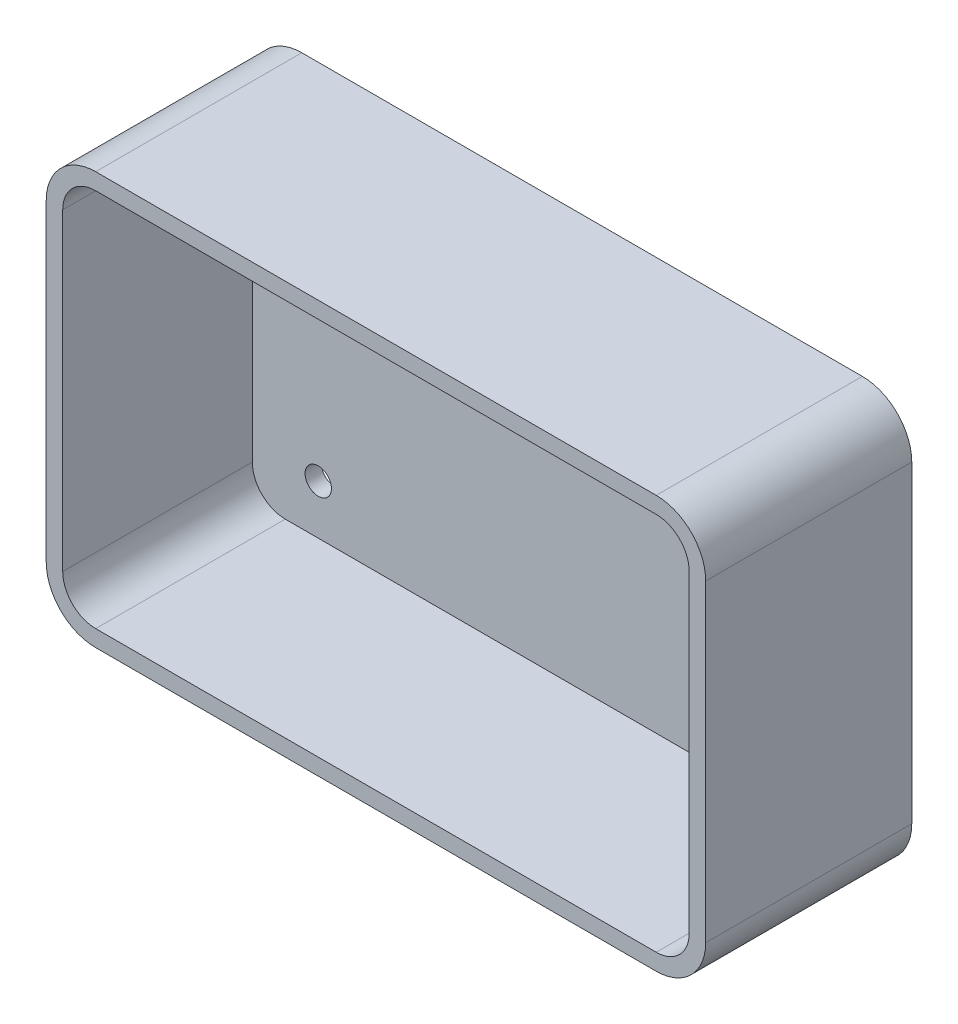
ISO-10303-21;
HEADER;
FILE_DESCRIPTION(('STEP AP214'),'2;1');
FILE_NAME('part.step','',(''),(''),'','','');
FILE_SCHEMA(('AUTOMOTIVE_DESIGN { 1 0 10303 214 1 1 1 1 }'));
ENDSEC;
DATA;
#1=APPLICATION_CONTEXT('core data for automotive mechanical design processes');
#2=APPLICATION_PROTOCOL_DEFINITION('international standard','automotive_design',2000,#1);
#3=PRODUCT_CONTEXT('',#1,'mechanical');
#4=PRODUCT('Part','Part','',(#3));
#5=PRODUCT_RELATED_PRODUCT_CATEGORY('part','',(#4));
#6=PRODUCT_DEFINITION_FORMATION('','',#4);
#7=PRODUCT_DEFINITION_CONTEXT('part definition',#1,'design');
#8=PRODUCT_DEFINITION('design','',#6,#7);
#9=PRODUCT_DEFINITION_SHAPE('','',#8);
#10=(LENGTH_UNIT() NAMED_UNIT(*) SI_UNIT(.MILLI.,.METRE.));
#11=(NAMED_UNIT(*) PLANE_ANGLE_UNIT() SI_UNIT($,.RADIAN.));
#12=(NAMED_UNIT(*) SI_UNIT($,.STERADIAN.) SOLID_ANGLE_UNIT());
#13=UNCERTAINTY_MEASURE_WITH_UNIT(LENGTH_MEASURE(1.E-05),#10,'distance_accuracy_value','');
#14=(GEOMETRIC_REPRESENTATION_CONTEXT(3) GLOBAL_UNCERTAINTY_ASSIGNED_CONTEXT((#13)) GLOBAL_UNIT_ASSIGNED_CONTEXT((#10,
#11,#12)) REPRESENTATION_CONTEXT('',''));
#15=CARTESIAN_POINT('',(0.,0.,0.));
#16=DIRECTION('',(0.,0.,1.));
#17=DIRECTION('',(1.,0.,0.));
#18=AXIS2_PLACEMENT_3D('',#15,#16,#17);
#19=CARTESIAN_POINT('',(-34.,-19.,25.));
#20=DIRECTION('',(0.,0.,-1.));
#21=DIRECTION('',(-1.,0.,0.));
#22=AXIS2_PLACEMENT_3D('',#19,#20,#21);
#23=CYLINDRICAL_SURFACE('',#22,6.);
#24=CARTESIAN_POINT('',(-34.,-19.,0.));
#25=DIRECTION('',(0.,0.,1.));
#26=DIRECTION('',(1.,0.,0.));
#27=AXIS2_PLACEMENT_3D('',#24,#25,#26);
#28=CIRCLE('',#27,6.);
#29=CARTESIAN_POINT('',(-40.,-19.,0.));
#30=VERTEX_POINT('',#29);
#31=CARTESIAN_POINT('',(-34.,-25.,0.));
#32=VERTEX_POINT('',#31);
#33=EDGE_CURVE('E148',#30,#32,#28,.T.);
#34=ORIENTED_EDGE('',*,*,#33,.T.);
#35=DIRECTION('',(0.,0.,-1.));
#36=VECTOR('',#35,1.);
#37=CARTESIAN_POINT('',(-34.,-25.,25.));
#38=LINE('',#37,#36);
#39=CARTESIAN_POINT('',(-34.,-25.,25.));
#40=VERTEX_POINT('',#39);
#41=EDGE_CURVE('E11',#40,#32,#38,.T.);
#42=ORIENTED_EDGE('',*,*,#41,.F.);
#43=CARTESIAN_POINT('',(-34.,-19.,25.));
#44=DIRECTION('',(0.,0.,1.));
#45=DIRECTION('',(1.,0.,0.));
#46=AXIS2_PLACEMENT_3D('',#43,#44,#45);
#47=CIRCLE('',#46,6.);
#48=CARTESIAN_POINT('',(-40.,-19.,25.));
#49=VERTEX_POINT('',#48);
#50=EDGE_CURVE('E164',#49,#40,#47,.T.);
#51=ORIENTED_EDGE('',*,*,#50,.F.);
#52=DIRECTION('',(0.,0.,-1.));
#53=VECTOR('',#52,1.);
#54=CARTESIAN_POINT('',(-40.,-19.,25.));
#55=LINE('',#54,#53);
#56=EDGE_CURVE('E144',#49,#30,#55,.T.);
#57=ORIENTED_EDGE('',*,*,#56,.T.);
#58=EDGE_LOOP('',(#34,#42,#51,#57));
#59=FACE_BOUND('',#58,.T.);
#60=ADVANCED_FACE('F39',(#59),#23,.T.);
#61=CARTESIAN_POINT('',(-34.,-25.,25.));
#62=DIRECTION('',(0.,1.,0.));
#63=DIRECTION('',(0.,0.,1.));
#64=AXIS2_PLACEMENT_3D('',#61,#62,#63);
#65=PLANE('',#64);
#66=DIRECTION('',(1.,0.,0.));
#67=VECTOR('',#66,1.);
#68=CARTESIAN_POINT('',(-34.,-25.,0.));
#69=LINE('',#68,#67);
#70=CARTESIAN_POINT('',(34.,-25.,0.));
#71=VERTEX_POINT('',#70);
#72=EDGE_CURVE('E151',#32,#71,#69,.T.);
#73=ORIENTED_EDGE('',*,*,#72,.T.);
#74=DIRECTION('',(0.,0.,-1.));
#75=VECTOR('',#74,1.);
#76=CARTESIAN_POINT('',(34.,-25.,25.));
#77=LINE('',#76,#75);
#78=CARTESIAN_POINT('',(34.,-25.,25.));
#79=VERTEX_POINT('',#78);
#80=EDGE_CURVE('E47',#79,#71,#77,.T.);
#81=ORIENTED_EDGE('',*,*,#80,.F.);
#82=DIRECTION('',(1.,0.,0.));
#83=VECTOR('',#82,1.);
#84=CARTESIAN_POINT('',(-34.,-25.,25.));
#85=LINE('',#84,#83);
#86=EDGE_CURVE('E105',#40,#79,#85,.T.);
#87=ORIENTED_EDGE('',*,*,#86,.F.);
#88=ORIENTED_EDGE('',*,*,#41,.T.);
#89=EDGE_LOOP('',(#73,#81,#87,#88));
#90=FACE_BOUND('',#89,.T.);
#91=ADVANCED_FACE('F288',(#90),#65,.F.);
#92=CARTESIAN_POINT('',(34.,-19.,25.));
#93=DIRECTION('',(0.,0.,-1.));
#94=DIRECTION('',(-1.,0.,0.));
#95=AXIS2_PLACEMENT_3D('',#92,#93,#94);
#96=CYLINDRICAL_SURFACE('',#95,6.);
#97=CARTESIAN_POINT('',(34.,-19.,0.));
#98=DIRECTION('',(0.,0.,1.));
#99=DIRECTION('',(1.,0.,0.));
#100=AXIS2_PLACEMENT_3D('',#97,#98,#99);
#101=CIRCLE('',#100,6.);
#102=CARTESIAN_POINT('',(40.,-19.,0.));
#103=VERTEX_POINT('',#102);
#104=EDGE_CURVE('E154',#71,#103,#101,.T.);
#105=ORIENTED_EDGE('',*,*,#104,.T.);
#106=DIRECTION('',(0.,0.,-1.));
#107=VECTOR('',#106,1.);
#108=CARTESIAN_POINT('',(40.,-19.,25.));
#109=LINE('',#108,#107);
#110=CARTESIAN_POINT('',(40.,-19.,25.));
#111=VERTEX_POINT('',#110);
#112=EDGE_CURVE('E171',#111,#103,#109,.T.);
#113=ORIENTED_EDGE('',*,*,#112,.F.);
#114=CARTESIAN_POINT('',(34.,-19.,25.));
#115=DIRECTION('',(0.,0.,1.));
#116=DIRECTION('',(1.,0.,0.));
#117=AXIS2_PLACEMENT_3D('',#114,#115,#116);
#118=CIRCLE('',#117,6.);
#119=EDGE_CURVE('E268',#79,#111,#118,.T.);
#120=ORIENTED_EDGE('',*,*,#119,.F.);
#121=ORIENTED_EDGE('',*,*,#80,.T.);
#122=EDGE_LOOP('',(#105,#113,#120,#121));
#123=FACE_BOUND('',#122,.T.);
#124=ADVANCED_FACE('F291',(#123),#96,.T.);
#125=CARTESIAN_POINT('',(40.,-19.,25.));
#126=DIRECTION('',(-1.,0.,0.));
#127=DIRECTION('',(0.,0.,1.));
#128=AXIS2_PLACEMENT_3D('',#125,#126,#127);
#129=PLANE('',#128);
#130=DIRECTION('',(0.,1.,0.));
#131=VECTOR('',#130,1.);
#132=CARTESIAN_POINT('',(40.,-19.,0.));
#133=LINE('',#132,#131);
#134=CARTESIAN_POINT('',(40.,19.,0.));
#135=VERTEX_POINT('',#134);
#136=EDGE_CURVE('E156',#103,#135,#133,.T.);
#137=ORIENTED_EDGE('',*,*,#136,.T.);
#138=DIRECTION('',(0.,0.,-1.));
#139=VECTOR('',#138,1.);
#140=CARTESIAN_POINT('',(40.,19.,25.));
#141=LINE('',#140,#139);
#142=CARTESIAN_POINT('',(40.,19.,25.));
#143=VERTEX_POINT('',#142);
#144=EDGE_CURVE('E168',#143,#135,#141,.T.);
#145=ORIENTED_EDGE('',*,*,#144,.F.);
#146=DIRECTION('',(0.,1.,0.));
#147=VECTOR('',#146,1.);
#148=CARTESIAN_POINT('',(40.,-19.,25.));
#149=LINE('',#148,#147);
#150=EDGE_CURVE('E270',#111,#143,#149,.T.);
#151=ORIENTED_EDGE('',*,*,#150,.F.);
#152=ORIENTED_EDGE('',*,*,#112,.T.);
#153=EDGE_LOOP('',(#137,#145,#151,#152));
#154=FACE_BOUND('',#153,.T.);
#155=ADVANCED_FACE('F276',(#154),#129,.F.);
#156=CARTESIAN_POINT('',(34.,19.,25.));
#157=DIRECTION('',(0.,0.,-1.));
#158=DIRECTION('',(-1.,0.,0.));
#159=AXIS2_PLACEMENT_3D('',#156,#157,#158);
#160=CYLINDRICAL_SURFACE('',#159,6.);
#161=CARTESIAN_POINT('',(34.,19.,0.));
#162=DIRECTION('',(0.,0.,1.));
#163=DIRECTION('',(1.,0.,0.));
#164=AXIS2_PLACEMENT_3D('',#161,#162,#163);
#165=CIRCLE('',#164,6.);
#166=CARTESIAN_POINT('',(34.,25.,0.));
#167=VERTEX_POINT('',#166);
#168=EDGE_CURVE('E158',#135,#167,#165,.T.);
#169=ORIENTED_EDGE('',*,*,#168,.T.);
#170=DIRECTION('',(0.,0.,-1.));
#171=VECTOR('',#170,1.);
#172=CARTESIAN_POINT('',(34.,25.,25.));
#173=LINE('',#172,#171);
#174=CARTESIAN_POINT('',(34.,25.,25.));
#175=VERTEX_POINT('',#174);
#176=EDGE_CURVE('E139',#175,#167,#173,.T.);
#177=ORIENTED_EDGE('',*,*,#176,.F.);
#178=CARTESIAN_POINT('',(34.,19.,25.));
#179=DIRECTION('',(0.,0.,1.));
#180=DIRECTION('',(1.,0.,0.));
#181=AXIS2_PLACEMENT_3D('',#178,#179,#180);
#182=CIRCLE('',#181,6.);
#183=EDGE_CURVE('E127',#143,#175,#182,.T.);
#184=ORIENTED_EDGE('',*,*,#183,.F.);
#185=ORIENTED_EDGE('',*,*,#144,.T.);
#186=EDGE_LOOP('',(#169,#177,#184,#185));
#187=FACE_BOUND('',#186,.T.);
#188=ADVANCED_FACE('F280',(#187),#160,.T.);
#189=CARTESIAN_POINT('',(34.,25.,25.));
#190=DIRECTION('',(0.,-1.,0.));
#191=DIRECTION('',(0.,0.,-1.));
#192=AXIS2_PLACEMENT_3D('',#189,#190,#191);
#193=PLANE('',#192);
#194=DIRECTION('',(-1.,0.,0.));
#195=VECTOR('',#194,1.);
#196=CARTESIAN_POINT('',(34.,25.,0.));
#197=LINE('',#196,#195);
#198=CARTESIAN_POINT('',(-34.,25.,0.));
#199=VERTEX_POINT('',#198);
#200=EDGE_CURVE('E136',#167,#199,#197,.T.);
#201=ORIENTED_EDGE('',*,*,#200,.T.);
#202=DIRECTION('',(0.,0.,-1.));
#203=VECTOR('',#202,1.);
#204=CARTESIAN_POINT('',(-34.,25.,25.));
#205=LINE('',#204,#203);
#206=CARTESIAN_POINT('',(-34.,25.,25.));
#207=VERTEX_POINT('',#206);
#208=EDGE_CURVE('E133',#207,#199,#205,.T.);
#209=ORIENTED_EDGE('',*,*,#208,.F.);
#210=DIRECTION('',(-1.,0.,0.));
#211=VECTOR('',#210,1.);
#212=CARTESIAN_POINT('',(34.,25.,25.));
#213=LINE('',#212,#211);
#214=EDGE_CURVE('E120',#175,#207,#213,.T.);
#215=ORIENTED_EDGE('',*,*,#214,.F.);
#216=ORIENTED_EDGE('',*,*,#176,.T.);
#217=EDGE_LOOP('',(#201,#209,#215,#216));
#218=FACE_BOUND('',#217,.T.);
#219=ADVANCED_FACE('F134',(#218),#193,.F.);
#220=CARTESIAN_POINT('',(-34.,19.,25.));
#221=DIRECTION('',(0.,0.,-1.));
#222=DIRECTION('',(-1.,0.,0.));
#223=AXIS2_PLACEMENT_3D('',#220,#221,#222);
#224=CYLINDRICAL_SURFACE('',#223,6.);
#225=CARTESIAN_POINT('',(-34.,19.,0.));
#226=DIRECTION('',(0.,0.,1.));
#227=DIRECTION('',(1.,0.,0.));
#228=AXIS2_PLACEMENT_3D('',#225,#226,#227);
#229=CIRCLE('',#228,6.);
#230=CARTESIAN_POINT('',(-40.,19.,0.));
#231=VERTEX_POINT('',#230);
#232=EDGE_CURVE('E161',#199,#231,#229,.T.);
#233=ORIENTED_EDGE('',*,*,#232,.T.);
#234=DIRECTION('',(0.,0.,-1.));
#235=VECTOR('',#234,1.);
#236=CARTESIAN_POINT('',(-40.,19.,25.));
#237=LINE('',#236,#235);
#238=CARTESIAN_POINT('',(-40.,19.,25.));
#239=VERTEX_POINT('',#238);
#240=EDGE_CURVE('E140',#239,#231,#237,.T.);
#241=ORIENTED_EDGE('',*,*,#240,.F.);
#242=CARTESIAN_POINT('',(-34.,19.,25.));
#243=DIRECTION('',(0.,0.,1.));
#244=DIRECTION('',(1.,0.,0.));
#245=AXIS2_PLACEMENT_3D('',#242,#243,#244);
#246=CIRCLE('',#245,6.);
#247=EDGE_CURVE('E124',#207,#239,#246,.T.);
#248=ORIENTED_EDGE('',*,*,#247,.F.);
#249=ORIENTED_EDGE('',*,*,#208,.T.);
#250=EDGE_LOOP('',(#233,#241,#248,#249));
#251=FACE_BOUND('',#250,.T.);
#252=ADVANCED_FACE('F142',(#251),#224,.T.);
#253=CARTESIAN_POINT('',(-40.,19.,25.));
#254=DIRECTION('',(1.,0.,0.));
#255=DIRECTION('',(0.,0.,-1.));
#256=AXIS2_PLACEMENT_3D('',#253,#254,#255);
#257=PLANE('',#256);
#258=DIRECTION('',(0.,-1.,0.));
#259=VECTOR('',#258,1.);
#260=CARTESIAN_POINT('',(-40.,19.,0.));
#261=LINE('',#260,#259);
#262=EDGE_CURVE('E97',#231,#30,#261,.T.);
#263=ORIENTED_EDGE('',*,*,#262,.T.);
#264=ORIENTED_EDGE('',*,*,#56,.F.);
#265=DIRECTION('',(0.,-1.,0.));
#266=VECTOR('',#265,1.);
#267=CARTESIAN_POINT('',(-40.,19.,25.));
#268=LINE('',#267,#266);
#269=EDGE_CURVE('E64',#239,#49,#268,.T.);
#270=ORIENTED_EDGE('',*,*,#269,.F.);
#271=ORIENTED_EDGE('',*,*,#240,.T.);
#272=EDGE_LOOP('',(#263,#264,#270,#271));
#273=FACE_BOUND('',#272,.T.);
#274=ADVANCED_FACE('F284',(#273),#257,.F.);
#275=CARTESIAN_POINT('',(-34.,-19.,25.));
#276=DIRECTION('',(0.,0.,1.));
#277=DIRECTION('',(1.,0.,0.));
#278=AXIS2_PLACEMENT_3D('',#275,#276,#277);
#279=PLANE('',#278);
#280=CARTESIAN_POINT('',(-34.,-19.,25.));
#281=DIRECTION('',(0.,0.,1.));
#282=DIRECTION('',(1.,0.,0.));
#283=AXIS2_PLACEMENT_3D('',#280,#281,#282);
#284=CIRCLE('',#283,4.);
#285=CARTESIAN_POINT('',(-38.,-19.,25.));
#286=VERTEX_POINT('',#285);
#287=CARTESIAN_POINT('',(-34.,-23.,25.));
#288=VERTEX_POINT('',#287);
#289=EDGE_CURVE('E245',#286,#288,#284,.T.);
#290=ORIENTED_EDGE('',*,*,#289,.F.);
#291=DIRECTION('',(0.,-1.,0.));
#292=VECTOR('',#291,1.);
#293=CARTESIAN_POINT('',(-38.,19.,25.));
#294=LINE('',#293,#292);
#295=CARTESIAN_POINT('',(-38.,19.,25.));
#296=VERTEX_POINT('',#295);
#297=EDGE_CURVE('E209',#296,#286,#294,.T.);
#298=ORIENTED_EDGE('',*,*,#297,.F.);
#299=CARTESIAN_POINT('',(-34.,19.,25.));
#300=DIRECTION('',(0.,0.,1.));
#301=DIRECTION('',(1.,0.,0.));
#302=AXIS2_PLACEMENT_3D('',#299,#300,#301);
#303=CIRCLE('',#302,4.);
#304=CARTESIAN_POINT('',(-34.,23.,25.));
#305=VERTEX_POINT('',#304);
#306=EDGE_CURVE('E263',#305,#296,#303,.T.);
#307=ORIENTED_EDGE('',*,*,#306,.F.);
#308=DIRECTION('',(-1.,0.,0.));
#309=VECTOR('',#308,1.);
#310=CARTESIAN_POINT('',(34.,23.,25.));
#311=LINE('',#310,#309);
#312=CARTESIAN_POINT('',(34.,23.,25.));
#313=VERTEX_POINT('',#312);
#314=EDGE_CURVE('E260',#313,#305,#311,.T.);
#315=ORIENTED_EDGE('',*,*,#314,.F.);
#316=CARTESIAN_POINT('',(34.,19.,25.));
#317=DIRECTION('',(0.,0.,1.));
#318=DIRECTION('',(1.,0.,0.));
#319=AXIS2_PLACEMENT_3D('',#316,#317,#318);
#320=CIRCLE('',#319,4.);
#321=CARTESIAN_POINT('',(38.,19.,25.));
#322=VERTEX_POINT('',#321);
#323=EDGE_CURVE('E257',#322,#313,#320,.T.);
#324=ORIENTED_EDGE('',*,*,#323,.F.);
#325=DIRECTION('',(0.,1.,0.));
#326=VECTOR('',#325,1.);
#327=CARTESIAN_POINT('',(38.,-19.,25.));
#328=LINE('',#327,#326);
#329=CARTESIAN_POINT('',(38.,-19.,25.));
#330=VERTEX_POINT('',#329);
#331=EDGE_CURVE('E254',#330,#322,#328,.T.);
#332=ORIENTED_EDGE('',*,*,#331,.F.);
#333=CARTESIAN_POINT('',(34.,-19.,25.));
#334=DIRECTION('',(0.,0.,1.));
#335=DIRECTION('',(1.,0.,0.));
#336=AXIS2_PLACEMENT_3D('',#333,#334,#335);
#337=CIRCLE('',#336,4.);
#338=CARTESIAN_POINT('',(34.,-23.,25.));
#339=VERTEX_POINT('',#338);
#340=EDGE_CURVE('E251',#339,#330,#337,.T.);
#341=ORIENTED_EDGE('',*,*,#340,.F.);
#342=DIRECTION('',(1.,0.,0.));
#343=VECTOR('',#342,1.);
#344=CARTESIAN_POINT('',(-34.,-23.,25.));
#345=LINE('',#344,#343);
#346=EDGE_CURVE('E248',#288,#339,#345,.T.);
#347=ORIENTED_EDGE('',*,*,#346,.F.);
#348=EDGE_LOOP('',(#290,#298,#307,#315,#324,#332,#341,#347));
#349=FACE_BOUND('',#348,.T.);
#350=ORIENTED_EDGE('',*,*,#50,.T.);
#351=ORIENTED_EDGE('',*,*,#86,.T.);
#352=ORIENTED_EDGE('',*,*,#119,.T.);
#353=ORIENTED_EDGE('',*,*,#150,.T.);
#354=ORIENTED_EDGE('',*,*,#183,.T.);
#355=ORIENTED_EDGE('',*,*,#214,.T.);
#356=ORIENTED_EDGE('',*,*,#247,.T.);
#357=ORIENTED_EDGE('',*,*,#269,.T.);
#358=EDGE_LOOP('',(#350,#351,#352,#353,#354,#355,#356,#357));
#359=FACE_BOUND('',#358,.T.);
#360=ADVANCED_FACE('F122',(#349,#359),#279,.T.);
#361=CARTESIAN_POINT('',(-34.,-19.,0.));
#362=DIRECTION('',(0.,0.,1.));
#363=DIRECTION('',(1.,0.,0.));
#364=AXIS2_PLACEMENT_3D('',#361,#362,#363);
#365=PLANE('',#364);
#366=CARTESIAN_POINT('',(-30.,17.,0.));
#367=DIRECTION('',(0.,0.,1.));
#368=DIRECTION('',(1.,0.,0.));
#369=AXIS2_PLACEMENT_3D('',#366,#367,#368);
#370=CIRCLE('',#369,1.6);
#371=CARTESIAN_POINT('',(-28.4,17.,0.));
#372=VERTEX_POINT('',#371);
#373=EDGE_CURVE('E196',#372,#372,#370,.T.);
#374=ORIENTED_EDGE('',*,*,#373,.T.);
#375=EDGE_LOOP('',(#374));
#376=FACE_BOUND('',#375,.T.);
#377=CARTESIAN_POINT('',(30.,-17.,0.));
#378=DIRECTION('',(0.,0.,1.));
#379=DIRECTION('',(1.,0.,0.));
#380=AXIS2_PLACEMENT_3D('',#377,#378,#379);
#381=CIRCLE('',#380,1.6);
#382=CARTESIAN_POINT('',(31.6,-17.,0.));
#383=VERTEX_POINT('',#382);
#384=EDGE_CURVE('E185',#383,#383,#381,.T.);
#385=ORIENTED_EDGE('',*,*,#384,.T.);
#386=EDGE_LOOP('',(#385));
#387=FACE_BOUND('',#386,.T.);
#388=CARTESIAN_POINT('',(30.,17.,0.));
#389=DIRECTION('',(0.,0.,1.));
#390=DIRECTION('',(1.,0.,0.));
#391=AXIS2_PLACEMENT_3D('',#388,#389,#390);
#392=CIRCLE('',#391,1.6);
#393=CARTESIAN_POINT('',(31.6,17.,0.));
#394=VERTEX_POINT('',#393);
#395=EDGE_CURVE('E182',#394,#394,#392,.T.);
#396=ORIENTED_EDGE('',*,*,#395,.T.);
#397=EDGE_LOOP('',(#396));
#398=FACE_BOUND('',#397,.T.);
#399=CARTESIAN_POINT('',(-30.,-17.,0.));
#400=DIRECTION('',(0.,0.,1.));
#401=DIRECTION('',(1.,0.,0.));
#402=AXIS2_PLACEMENT_3D('',#399,#400,#401);
#403=CIRCLE('',#402,1.6);
#404=CARTESIAN_POINT('',(-28.4,-17.,0.));
#405=VERTEX_POINT('',#404);
#406=EDGE_CURVE('E179',#405,#405,#403,.T.);
#407=ORIENTED_EDGE('',*,*,#406,.T.);
#408=EDGE_LOOP('',(#407));
#409=FACE_BOUND('',#408,.T.);
#410=ORIENTED_EDGE('',*,*,#33,.F.);
#411=ORIENTED_EDGE('',*,*,#262,.F.);
#412=ORIENTED_EDGE('',*,*,#232,.F.);
#413=ORIENTED_EDGE('',*,*,#200,.F.);
#414=ORIENTED_EDGE('',*,*,#168,.F.);
#415=ORIENTED_EDGE('',*,*,#136,.F.);
#416=ORIENTED_EDGE('',*,*,#104,.F.);
#417=ORIENTED_EDGE('',*,*,#72,.F.);
#418=EDGE_LOOP('',(#410,#411,#412,#413,#414,#415,#416,#417));
#419=FACE_BOUND('',#418,.T.);
#420=ADVANCED_FACE('F283',(#376,#387,#398,#409,#419),#365,.F.);
#421=CARTESIAN_POINT('',(-34.,-19.,25.));
#422=DIRECTION('',(0.,0.,-1.));
#423=DIRECTION('',(-1.,0.,0.));
#424=AXIS2_PLACEMENT_3D('',#421,#422,#423);
#425=CYLINDRICAL_SURFACE('',#424,4.);
#426=CARTESIAN_POINT('',(-34.,-19.,2.));
#427=DIRECTION('',(0.,0.,1.));
#428=DIRECTION('',(1.,0.,0.));
#429=AXIS2_PLACEMENT_3D('',#426,#427,#428);
#430=CIRCLE('',#429,4.);
#431=CARTESIAN_POINT('',(-38.,-19.,2.));
#432=VERTEX_POINT('',#431);
#433=CARTESIAN_POINT('',(-34.,-23.,2.));
#434=VERTEX_POINT('',#433);
#435=EDGE_CURVE('E199',#432,#434,#430,.T.);
#436=ORIENTED_EDGE('',*,*,#435,.F.);
#437=DIRECTION('',(0.,0.,-1.));
#438=VECTOR('',#437,1.);
#439=CARTESIAN_POINT('',(-38.,-19.,25.));
#440=LINE('',#439,#438);
#441=EDGE_CURVE('E206',#286,#432,#440,.T.);
#442=ORIENTED_EDGE('',*,*,#441,.F.);
#443=ORIENTED_EDGE('',*,*,#289,.T.);
#444=DIRECTION('',(0.,0.,1.));
#445=VECTOR('',#444,1.);
#446=CARTESIAN_POINT('',(-34.,-23.,25.));
#447=LINE('',#446,#445);
#448=EDGE_CURVE('E152',#288,#434,#447,.F.);
#449=ORIENTED_EDGE('',*,*,#448,.T.);
#450=EDGE_LOOP('',(#436,#442,#443,#449));
#451=FACE_BOUND('',#450,.T.);
#452=ADVANCED_FACE('F369',(#451),#425,.F.);
#453=CARTESIAN_POINT('',(-34.,-23.,25.));
#454=DIRECTION('',(0.,1.,0.));
#455=DIRECTION('',(0.,0.,1.));
#456=AXIS2_PLACEMENT_3D('',#453,#454,#455);
#457=PLANE('',#456);
#458=DIRECTION('',(1.,0.,0.));
#459=VECTOR('',#458,1.);
#460=CARTESIAN_POINT('',(-34.,-23.,2.));
#461=LINE('',#460,#459);
#462=CARTESIAN_POINT('',(34.,-23.,2.));
#463=VERTEX_POINT('',#462);
#464=EDGE_CURVE('E202',#434,#463,#461,.T.);
#465=ORIENTED_EDGE('',*,*,#464,.F.);
#466=ORIENTED_EDGE('',*,*,#448,.F.);
#467=ORIENTED_EDGE('',*,*,#346,.T.);
#468=DIRECTION('',(0.,0.,-1.));
#469=VECTOR('',#468,1.);
#470=CARTESIAN_POINT('',(34.,-23.,25.));
#471=LINE('',#470,#469);
#472=EDGE_CURVE('E205',#339,#463,#471,.T.);
#473=ORIENTED_EDGE('',*,*,#472,.T.);
#474=EDGE_LOOP('',(#465,#466,#467,#473));
#475=FACE_BOUND('',#474,.T.);
#476=ADVANCED_FACE('F380',(#475),#457,.T.);
#477=CARTESIAN_POINT('',(34.,-19.,25.));
#478=DIRECTION('',(0.,0.,-1.));
#479=DIRECTION('',(-1.,0.,0.));
#480=AXIS2_PLACEMENT_3D('',#477,#478,#479);
#481=CYLINDRICAL_SURFACE('',#480,4.);
#482=CARTESIAN_POINT('',(34.,-19.,2.));
#483=DIRECTION('',(0.,0.,1.));
#484=DIRECTION('',(1.,0.,0.));
#485=AXIS2_PLACEMENT_3D('',#482,#483,#484);
#486=CIRCLE('',#485,4.);
#487=CARTESIAN_POINT('',(38.,-19.,2.));
#488=VERTEX_POINT('',#487);
#489=EDGE_CURVE('E212',#463,#488,#486,.T.);
#490=ORIENTED_EDGE('',*,*,#489,.F.);
#491=ORIENTED_EDGE('',*,*,#472,.F.);
#492=ORIENTED_EDGE('',*,*,#340,.T.);
#493=DIRECTION('',(0.,0.,1.));
#494=VECTOR('',#493,1.);
#495=CARTESIAN_POINT('',(38.,-19.,25.));
#496=LINE('',#495,#494);
#497=EDGE_CURVE('E215',#330,#488,#496,.F.);
#498=ORIENTED_EDGE('',*,*,#497,.T.);
#499=EDGE_LOOP('',(#490,#491,#492,#498));
#500=FACE_BOUND('',#499,.T.);
#501=ADVANCED_FACE('F390',(#500),#481,.F.);
#502=CARTESIAN_POINT('',(38.,-19.,25.));
#503=DIRECTION('',(-1.,0.,0.));
#504=DIRECTION('',(0.,0.,1.));
#505=AXIS2_PLACEMENT_3D('',#502,#503,#504);
#506=PLANE('',#505);
#507=DIRECTION('',(0.,1.,0.));
#508=VECTOR('',#507,1.);
#509=CARTESIAN_POINT('',(38.,-19.,2.));
#510=LINE('',#509,#508);
#511=CARTESIAN_POINT('',(38.,19.,2.));
#512=VERTEX_POINT('',#511);
#513=EDGE_CURVE('E218',#488,#512,#510,.T.);
#514=ORIENTED_EDGE('',*,*,#513,.F.);
#515=ORIENTED_EDGE('',*,*,#497,.F.);
#516=ORIENTED_EDGE('',*,*,#331,.T.);
#517=DIRECTION('',(0.,0.,-1.));
#518=VECTOR('',#517,1.);
#519=CARTESIAN_POINT('',(38.,19.,25.));
#520=LINE('',#519,#518);
#521=EDGE_CURVE('E221',#322,#512,#520,.T.);
#522=ORIENTED_EDGE('',*,*,#521,.T.);
#523=EDGE_LOOP('',(#514,#515,#516,#522));
#524=FACE_BOUND('',#523,.T.);
#525=ADVANCED_FACE('F400',(#524),#506,.T.);
#526=CARTESIAN_POINT('',(34.,19.,25.));
#527=DIRECTION('',(0.,0.,-1.));
#528=DIRECTION('',(-1.,0.,0.));
#529=AXIS2_PLACEMENT_3D('',#526,#527,#528);
#530=CYLINDRICAL_SURFACE('',#529,4.);
#531=CARTESIAN_POINT('',(34.,19.,2.));
#532=DIRECTION('',(0.,0.,1.));
#533=DIRECTION('',(1.,0.,0.));
#534=AXIS2_PLACEMENT_3D('',#531,#532,#533);
#535=CIRCLE('',#534,4.);
#536=CARTESIAN_POINT('',(34.,23.,2.));
#537=VERTEX_POINT('',#536);
#538=EDGE_CURVE('E224',#512,#537,#535,.T.);
#539=ORIENTED_EDGE('',*,*,#538,.F.);
#540=ORIENTED_EDGE('',*,*,#521,.F.);
#541=ORIENTED_EDGE('',*,*,#323,.T.);
#542=DIRECTION('',(0.,0.,-1.));
#543=VECTOR('',#542,1.);
#544=CARTESIAN_POINT('',(34.,23.,25.));
#545=LINE('',#544,#543);
#546=EDGE_CURVE('E227',#313,#537,#545,.T.);
#547=ORIENTED_EDGE('',*,*,#546,.T.);
#548=EDGE_LOOP('',(#539,#540,#541,#547));
#549=FACE_BOUND('',#548,.T.);
#550=ADVANCED_FACE('F410',(#549),#530,.F.);
#551=CARTESIAN_POINT('',(34.,23.,25.));
#552=DIRECTION('',(0.,-1.,0.));
#553=DIRECTION('',(0.,0.,-1.));
#554=AXIS2_PLACEMENT_3D('',#551,#552,#553);
#555=PLANE('',#554);
#556=DIRECTION('',(-1.,0.,0.));
#557=VECTOR('',#556,1.);
#558=CARTESIAN_POINT('',(34.,23.,2.));
#559=LINE('',#558,#557);
#560=CARTESIAN_POINT('',(-34.,23.,2.));
#561=VERTEX_POINT('',#560);
#562=EDGE_CURVE('E230',#537,#561,#559,.T.);
#563=ORIENTED_EDGE('',*,*,#562,.F.);
#564=ORIENTED_EDGE('',*,*,#546,.F.);
#565=ORIENTED_EDGE('',*,*,#314,.T.);
#566=DIRECTION('',(0.,0.,-1.));
#567=VECTOR('',#566,1.);
#568=CARTESIAN_POINT('',(-34.,23.,25.));
#569=LINE('',#568,#567);
#570=EDGE_CURVE('E233',#305,#561,#569,.T.);
#571=ORIENTED_EDGE('',*,*,#570,.T.);
#572=EDGE_LOOP('',(#563,#564,#565,#571));
#573=FACE_BOUND('',#572,.T.);
#574=ADVANCED_FACE('F420',(#573),#555,.T.);
#575=CARTESIAN_POINT('',(-34.,19.,25.));
#576=DIRECTION('',(0.,0.,-1.));
#577=DIRECTION('',(-1.,0.,0.));
#578=AXIS2_PLACEMENT_3D('',#575,#576,#577);
#579=CYLINDRICAL_SURFACE('',#578,4.);
#580=CARTESIAN_POINT('',(-34.,19.,2.));
#581=DIRECTION('',(0.,0.,1.));
#582=DIRECTION('',(1.,0.,0.));
#583=AXIS2_PLACEMENT_3D('',#580,#581,#582);
#584=CIRCLE('',#583,4.);
#585=CARTESIAN_POINT('',(-38.,19.,2.));
#586=VERTEX_POINT('',#585);
#587=EDGE_CURVE('E236',#561,#586,#584,.T.);
#588=ORIENTED_EDGE('',*,*,#587,.F.);
#589=ORIENTED_EDGE('',*,*,#570,.F.);
#590=ORIENTED_EDGE('',*,*,#306,.T.);
#591=DIRECTION('',(0.,0.,-1.));
#592=VECTOR('',#591,1.);
#593=CARTESIAN_POINT('',(-38.,19.,25.));
#594=LINE('',#593,#592);
#595=EDGE_CURVE('E55',#296,#586,#594,.T.);
#596=ORIENTED_EDGE('',*,*,#595,.T.);
#597=EDGE_LOOP('',(#588,#589,#590,#596));
#598=FACE_BOUND('',#597,.T.);
#599=ADVANCED_FACE('F430',(#598),#579,.F.);
#600=CARTESIAN_POINT('',(-38.,19.,25.));
#601=DIRECTION('',(1.,0.,0.));
#602=DIRECTION('',(0.,0.,-1.));
#603=AXIS2_PLACEMENT_3D('',#600,#601,#602);
#604=PLANE('',#603);
#605=DIRECTION('',(0.,-1.,0.));
#606=VECTOR('',#605,1.);
#607=CARTESIAN_POINT('',(-38.,19.,2.));
#608=LINE('',#607,#606);
#609=EDGE_CURVE('E241',#586,#432,#608,.T.);
#610=ORIENTED_EDGE('',*,*,#609,.F.);
#611=ORIENTED_EDGE('',*,*,#595,.F.);
#612=ORIENTED_EDGE('',*,*,#297,.T.);
#613=ORIENTED_EDGE('',*,*,#441,.T.);
#614=EDGE_LOOP('',(#610,#611,#612,#613));
#615=FACE_BOUND('',#614,.T.);
#616=ADVANCED_FACE('F440',(#615),#604,.T.);
#617=CARTESIAN_POINT('',(-34.,-19.,2.));
#618=DIRECTION('',(0.,0.,1.));
#619=DIRECTION('',(1.,0.,0.));
#620=AXIS2_PLACEMENT_3D('',#617,#618,#619);
#621=PLANE('',#620);
#622=CARTESIAN_POINT('',(-30.,17.,2.));
#623=DIRECTION('',(0.,0.,1.));
#624=DIRECTION('',(1.,0.,0.));
#625=AXIS2_PLACEMENT_3D('',#622,#623,#624);
#626=CIRCLE('',#625,1.6);
#627=CARTESIAN_POINT('',(-28.4,17.,2.));
#628=VERTEX_POINT('',#627);
#629=EDGE_CURVE('E42',#628,#628,#626,.T.);
#630=ORIENTED_EDGE('',*,*,#629,.F.);
#631=EDGE_LOOP('',(#630));
#632=FACE_BOUND('',#631,.T.);
#633=CARTESIAN_POINT('',(30.,-17.,2.));
#634=DIRECTION('',(0.,0.,1.));
#635=DIRECTION('',(1.,0.,0.));
#636=AXIS2_PLACEMENT_3D('',#633,#634,#635);
#637=CIRCLE('',#636,1.6);
#638=CARTESIAN_POINT('',(31.6,-17.,2.));
#639=VERTEX_POINT('',#638);
#640=EDGE_CURVE('E183',#639,#639,#637,.T.);
#641=ORIENTED_EDGE('',*,*,#640,.F.);
#642=EDGE_LOOP('',(#641));
#643=FACE_BOUND('',#642,.T.);
#644=CARTESIAN_POINT('',(30.,17.,2.));
#645=DIRECTION('',(0.,0.,1.));
#646=DIRECTION('',(1.,0.,0.));
#647=AXIS2_PLACEMENT_3D('',#644,#645,#646);
#648=CIRCLE('',#647,1.6);
#649=CARTESIAN_POINT('',(31.6,17.,2.));
#650=VERTEX_POINT('',#649);
#651=EDGE_CURVE('E180',#650,#650,#648,.T.);
#652=ORIENTED_EDGE('',*,*,#651,.F.);
#653=EDGE_LOOP('',(#652));
#654=FACE_BOUND('',#653,.T.);
#655=CARTESIAN_POINT('',(-30.,-17.,2.));
#656=DIRECTION('',(0.,0.,1.));
#657=DIRECTION('',(1.,0.,0.));
#658=AXIS2_PLACEMENT_3D('',#655,#656,#657);
#659=CIRCLE('',#658,1.6);
#660=CARTESIAN_POINT('',(-28.4,-17.,2.));
#661=VERTEX_POINT('',#660);
#662=EDGE_CURVE('E176',#661,#661,#659,.T.);
#663=ORIENTED_EDGE('',*,*,#662,.F.);
#664=EDGE_LOOP('',(#663));
#665=FACE_BOUND('',#664,.T.);
#666=ORIENTED_EDGE('',*,*,#435,.T.);
#667=ORIENTED_EDGE('',*,*,#464,.T.);
#668=ORIENTED_EDGE('',*,*,#489,.T.);
#669=ORIENTED_EDGE('',*,*,#513,.T.);
#670=ORIENTED_EDGE('',*,*,#538,.T.);
#671=ORIENTED_EDGE('',*,*,#562,.T.);
#672=ORIENTED_EDGE('',*,*,#587,.T.);
#673=ORIENTED_EDGE('',*,*,#609,.T.);
#674=EDGE_LOOP('',(#666,#667,#668,#669,#670,#671,#672,#673));
#675=FACE_BOUND('',#674,.T.);
#676=ADVANCED_FACE('F449',(#632,#643,#654,#665,#675),#621,.T.);
#677=CARTESIAN_POINT('',(-30.,-17.,-1.2E-05));
#678=DIRECTION('',(0.,0.,1.));
#679=DIRECTION('',(1.,0.,0.));
#680=AXIS2_PLACEMENT_3D('',#677,#678,#679);
#681=CYLINDRICAL_SURFACE('',#680,1.6);
#682=CARTESIAN_POINT('',(-28.4,-17.,2.));
#683=CARTESIAN_POINT('',(-28.4,-17.,1.97916666666667));
#684=CARTESIAN_POINT('',(-28.4,-17.,1.95833333333333));
#685=CARTESIAN_POINT('',(-28.4,-17.,1.91666666666667));
#686=CARTESIAN_POINT('',(-28.4,-17.,1.89583333333333));
#687=CARTESIAN_POINT('',(-28.4,-17.,1.85416666666667));
#688=CARTESIAN_POINT('',(-28.4,-17.,1.83333333333333));
#689=CARTESIAN_POINT('',(-28.4,-17.,1.79166666666667));
#690=CARTESIAN_POINT('',(-28.4,-17.,1.77083333333333));
#691=CARTESIAN_POINT('',(-28.4,-17.,1.72916666666667));
#692=CARTESIAN_POINT('',(-28.4,-17.,1.70833333333333));
#693=CARTESIAN_POINT('',(-28.4,-17.,1.66666666666667));
#694=CARTESIAN_POINT('',(-28.4,-17.,1.64583333333333));
#695=CARTESIAN_POINT('',(-28.4,-17.,1.60416666666667));
#696=CARTESIAN_POINT('',(-28.4,-17.,1.58333333333333));
#697=CARTESIAN_POINT('',(-28.4,-17.,1.54166666666667));
#698=CARTESIAN_POINT('',(-28.4,-17.,1.52083333333333));
#699=CARTESIAN_POINT('',(-28.4,-17.,1.47916666666667));
#700=CARTESIAN_POINT('',(-28.4,-17.,1.45833333333333));
#701=CARTESIAN_POINT('',(-28.4,-17.,1.41666666666667));
#702=CARTESIAN_POINT('',(-28.4,-17.,1.39583333333333));
#703=CARTESIAN_POINT('',(-28.4,-17.,1.35416666666667));
#704=CARTESIAN_POINT('',(-28.4,-17.,1.33333333333333));
#705=CARTESIAN_POINT('',(-28.4,-17.,1.29166666666667));
#706=CARTESIAN_POINT('',(-28.4,-17.,1.27083333333333));
#707=CARTESIAN_POINT('',(-28.4,-17.,1.22916666666667));
#708=CARTESIAN_POINT('',(-28.4,-17.,1.20833333333333));
#709=CARTESIAN_POINT('',(-28.4,-17.,1.16666666666667));
#710=CARTESIAN_POINT('',(-28.4,-17.,1.14583333333333));
#711=CARTESIAN_POINT('',(-28.4,-17.,1.10416666666667));
#712=CARTESIAN_POINT('',(-28.4,-17.,1.08333333333333));
#713=CARTESIAN_POINT('',(-28.4,-17.,1.04166666666667));
#714=CARTESIAN_POINT('',(-28.4,-17.,1.02083333333333));
#715=CARTESIAN_POINT('',(-28.4,-17.,0.979166666666667));
#716=CARTESIAN_POINT('',(-28.4,-17.,0.958333333333334));
#717=CARTESIAN_POINT('',(-28.4,-17.,0.916666666666667));
#718=CARTESIAN_POINT('',(-28.4,-17.,0.895833333333334));
#719=CARTESIAN_POINT('',(-28.4,-17.,0.854166666666667));
#720=CARTESIAN_POINT('',(-28.4,-17.,0.833333333333334));
#721=CARTESIAN_POINT('',(-28.4,-17.,0.791666666666667));
#722=CARTESIAN_POINT('',(-28.4,-17.,0.770833333333334));
#723=CARTESIAN_POINT('',(-28.4,-17.,0.729166666666667));
#724=CARTESIAN_POINT('',(-28.4,-17.,0.708333333333334));
#725=CARTESIAN_POINT('',(-28.4,-17.,0.666666666666667));
#726=CARTESIAN_POINT('',(-28.4,-17.,0.645833333333334));
#727=CARTESIAN_POINT('',(-28.4,-17.,0.604166666666667));
#728=CARTESIAN_POINT('',(-28.4,-17.,0.583333333333333));
#729=CARTESIAN_POINT('',(-28.4,-17.,0.541666666666667));
#730=CARTESIAN_POINT('',(-28.4,-17.,0.520833333333333));
#731=CARTESIAN_POINT('',(-28.4,-17.,0.479166666666667));
#732=CARTESIAN_POINT('',(-28.4,-17.,0.458333333333334));
#733=CARTESIAN_POINT('',(-28.4,-17.,0.416666666666667));
#734=CARTESIAN_POINT('',(-28.4,-17.,0.395833333333334));
#735=CARTESIAN_POINT('',(-28.4,-17.,0.354166666666667));
#736=CARTESIAN_POINT('',(-28.4,-17.,0.333333333333334));
#737=CARTESIAN_POINT('',(-28.4,-17.,0.291666666666667));
#738=CARTESIAN_POINT('',(-28.4,-17.,0.270833333333333));
#739=CARTESIAN_POINT('',(-28.4,-17.,0.229166666666667));
#740=CARTESIAN_POINT('',(-28.4,-17.,0.208333333333333));
#741=CARTESIAN_POINT('',(-28.4,-17.,0.166666666666667));
#742=CARTESIAN_POINT('',(-28.4,-17.,0.145833333333334));
#743=CARTESIAN_POINT('',(-28.4,-17.,0.104166666666667));
#744=CARTESIAN_POINT('',(-28.4,-17.,0.0833333333333336));
#745=CARTESIAN_POINT('',(-28.4,-17.,0.0416666666666669));
#746=CARTESIAN_POINT('',(-28.4,-17.,0.0208333333333335));
#747=CARTESIAN_POINT('',(-28.4,-17.,0.));
#748=B_SPLINE_CURVE_WITH_KNOTS('',3,(#682,#683,#684,#685,#686,#687,#688,#689,#690,#691,#692,
#693,#694,#695,#696,#697,#698,#699,#700,#701,#702,#703,#704,#705,#706,#707,#708,#709,#710,#711,
#712,#713,#714,#715,#716,#717,#718,#719,#720,#721,#722,#723,#724,#725,#726,#727,#728,#729,#730,
#731,#732,#733,#734,#735,#736,#737,#738,#739,#740,#741,#742,#743,#744,#745,#746,#747),
.UNSPECIFIED.,.F.,.F.,(4,2,2,2,2,2,2,2,2,2,2,2,2,2,2,2,2,2,2,2,2,2,2,2,2,2,2,2,2,2,2,2,4),(0.,
0.0624999999999996,0.125,0.1875,0.25,0.3125,0.375,0.4375,0.5,0.5625,0.625,0.6875,0.75,0.8125,
0.875,0.9375,1.,1.0625,1.125,1.1875,1.25,1.3125,1.375,1.4375,1.5,1.5625,1.625,1.6875,1.75,
1.8125,1.875,1.9375,2.),.UNSPECIFIED.);
#749=EDGE_CURVE('BSEAM457',#661,#405,#748,.T.);
#750=ORIENTED_EDGE('',*,*,#662,.T.);
#751=ORIENTED_EDGE('',*,*,#406,.F.);
#752=ORIENTED_EDGE('',*,*,#749,.T.);
#753=ORIENTED_EDGE('',*,*,#749,.F.);
#754=EDGE_LOOP('',(#750,#752,#751,#753));
#755=FACE_BOUND('',#754,.T.);
#756=ADVANCED_FACE('F457',(#755),#681,.F.);
#757=CARTESIAN_POINT('',(30.,17.,-1.2E-05));
#758=DIRECTION('',(0.,0.,1.));
#759=DIRECTION('',(1.,0.,0.));
#760=AXIS2_PLACEMENT_3D('',#757,#758,#759);
#761=CYLINDRICAL_SURFACE('',#760,1.6);
#762=CARTESIAN_POINT('',(31.6,17.,2.));
#763=CARTESIAN_POINT('',(31.6,17.,1.97916666666667));
#764=CARTESIAN_POINT('',(31.6,17.,1.95833333333333));
#765=CARTESIAN_POINT('',(31.6,17.,1.91666666666667));
#766=CARTESIAN_POINT('',(31.6,17.,1.89583333333333));
#767=CARTESIAN_POINT('',(31.6,17.,1.85416666666667));
#768=CARTESIAN_POINT('',(31.6,17.,1.83333333333333));
#769=CARTESIAN_POINT('',(31.6,17.,1.79166666666667));
#770=CARTESIAN_POINT('',(31.6,17.,1.77083333333333));
#771=CARTESIAN_POINT('',(31.6,17.,1.72916666666667));
#772=CARTESIAN_POINT('',(31.6,17.,1.70833333333333));
#773=CARTESIAN_POINT('',(31.6,17.,1.66666666666667));
#774=CARTESIAN_POINT('',(31.6,17.,1.64583333333333));
#775=CARTESIAN_POINT('',(31.6,17.,1.60416666666667));
#776=CARTESIAN_POINT('',(31.6,17.,1.58333333333333));
#777=CARTESIAN_POINT('',(31.6,17.,1.54166666666667));
#778=CARTESIAN_POINT('',(31.6,17.,1.52083333333333));
#779=CARTESIAN_POINT('',(31.6,17.,1.47916666666667));
#780=CARTESIAN_POINT('',(31.6,17.,1.45833333333333));
#781=CARTESIAN_POINT('',(31.6,17.,1.41666666666667));
#782=CARTESIAN_POINT('',(31.6,17.,1.39583333333333));
#783=CARTESIAN_POINT('',(31.6,17.,1.35416666666667));
#784=CARTESIAN_POINT('',(31.6,17.,1.33333333333333));
#785=CARTESIAN_POINT('',(31.6,17.,1.29166666666667));
#786=CARTESIAN_POINT('',(31.6,17.,1.27083333333333));
#787=CARTESIAN_POINT('',(31.6,17.,1.22916666666667));
#788=CARTESIAN_POINT('',(31.6,17.,1.20833333333333));
#789=CARTESIAN_POINT('',(31.6,17.,1.16666666666667));
#790=CARTESIAN_POINT('',(31.6,17.,1.14583333333333));
#791=CARTESIAN_POINT('',(31.6,17.,1.10416666666667));
#792=CARTESIAN_POINT('',(31.6,17.,1.08333333333333));
#793=CARTESIAN_POINT('',(31.6,17.,1.04166666666667));
#794=CARTESIAN_POINT('',(31.6,17.,1.02083333333333));
#795=CARTESIAN_POINT('',(31.6,17.,0.979166666666667));
#796=CARTESIAN_POINT('',(31.6,17.,0.958333333333334));
#797=CARTESIAN_POINT('',(31.6,17.,0.916666666666667));
#798=CARTESIAN_POINT('',(31.6,17.,0.895833333333334));
#799=CARTESIAN_POINT('',(31.6,17.,0.854166666666667));
#800=CARTESIAN_POINT('',(31.6,17.,0.833333333333334));
#801=CARTESIAN_POINT('',(31.6,17.,0.791666666666667));
#802=CARTESIAN_POINT('',(31.6,17.,0.770833333333334));
#803=CARTESIAN_POINT('',(31.6,17.,0.729166666666667));
#804=CARTESIAN_POINT('',(31.6,17.,0.708333333333334));
#805=CARTESIAN_POINT('',(31.6,17.,0.666666666666667));
#806=CARTESIAN_POINT('',(31.6,17.,0.645833333333334));
#807=CARTESIAN_POINT('',(31.6,17.,0.604166666666667));
#808=CARTESIAN_POINT('',(31.6,17.,0.583333333333333));
#809=CARTESIAN_POINT('',(31.6,17.,0.541666666666667));
#810=CARTESIAN_POINT('',(31.6,17.,0.520833333333333));
#811=CARTESIAN_POINT('',(31.6,17.,0.479166666666667));
#812=CARTESIAN_POINT('',(31.6,17.,0.458333333333334));
#813=CARTESIAN_POINT('',(31.6,17.,0.416666666666667));
#814=CARTESIAN_POINT('',(31.6,17.,0.395833333333334));
#815=CARTESIAN_POINT('',(31.6,17.,0.354166666666667));
#816=CARTESIAN_POINT('',(31.6,17.,0.333333333333334));
#817=CARTESIAN_POINT('',(31.6,17.,0.291666666666667));
#818=CARTESIAN_POINT('',(31.6,17.,0.270833333333333));
#819=CARTESIAN_POINT('',(31.6,17.,0.229166666666667));
#820=CARTESIAN_POINT('',(31.6,17.,0.208333333333333));
#821=CARTESIAN_POINT('',(31.6,17.,0.166666666666667));
#822=CARTESIAN_POINT('',(31.6,17.,0.145833333333334));
#823=CARTESIAN_POINT('',(31.6,17.,0.104166666666667));
#824=CARTESIAN_POINT('',(31.6,17.,0.0833333333333336));
#825=CARTESIAN_POINT('',(31.6,17.,0.0416666666666669));
#826=CARTESIAN_POINT('',(31.6,17.,0.0208333333333335));
#827=CARTESIAN_POINT('',(31.6,17.,0.));
#828=B_SPLINE_CURVE_WITH_KNOTS('',3,(#762,#763,#764,#765,#766,#767,#768,#769,#770,#771,#772,
#773,#774,#775,#776,#777,#778,#779,#780,#781,#782,#783,#784,#785,#786,#787,#788,#789,#790,#791,
#792,#793,#794,#795,#796,#797,#798,#799,#800,#801,#802,#803,#804,#805,#806,#807,#808,#809,#810,
#811,#812,#813,#814,#815,#816,#817,#818,#819,#820,#821,#822,#823,#824,#825,#826,#827),
.UNSPECIFIED.,.F.,.F.,(4,2,2,2,2,2,2,2,2,2,2,2,2,2,2,2,2,2,2,2,2,2,2,2,2,2,2,2,2,2,2,2,4),(0.,
0.0624999999999996,0.125,0.1875,0.25,0.3125,0.375,0.4375,0.5,0.5625,0.625,0.6875,0.75,0.8125,
0.875,0.9375,1.,1.0625,1.125,1.1875,1.25,1.3125,1.375,1.4375,1.5,1.5625,1.625,1.6875,1.75,
1.8125,1.875,1.9375,2.),.UNSPECIFIED.);
#829=EDGE_CURVE('BSEAM467',#650,#394,#828,.T.);
#830=ORIENTED_EDGE('',*,*,#651,.T.);
#831=ORIENTED_EDGE('',*,*,#395,.F.);
#832=ORIENTED_EDGE('',*,*,#829,.T.);
#833=ORIENTED_EDGE('',*,*,#829,.F.);
#834=EDGE_LOOP('',(#830,#832,#831,#833));
#835=FACE_BOUND('',#834,.T.);
#836=ADVANCED_FACE('F467',(#835),#761,.F.);
#837=CARTESIAN_POINT('',(30.,-17.,-1.2E-05));
#838=DIRECTION('',(0.,0.,1.));
#839=DIRECTION('',(1.,0.,0.));
#840=AXIS2_PLACEMENT_3D('',#837,#838,#839);
#841=CYLINDRICAL_SURFACE('',#840,1.6);
#842=CARTESIAN_POINT('',(31.6,-17.,2.));
#843=CARTESIAN_POINT('',(31.6,-17.,1.97916666666667));
#844=CARTESIAN_POINT('',(31.6,-17.,1.95833333333333));
#845=CARTESIAN_POINT('',(31.6,-17.,1.91666666666667));
#846=CARTESIAN_POINT('',(31.6,-17.,1.89583333333333));
#847=CARTESIAN_POINT('',(31.6,-17.,1.85416666666667));
#848=CARTESIAN_POINT('',(31.6,-17.,1.83333333333333));
#849=CARTESIAN_POINT('',(31.6,-17.,1.79166666666667));
#850=CARTESIAN_POINT('',(31.6,-17.,1.77083333333333));
#851=CARTESIAN_POINT('',(31.6,-17.,1.72916666666667));
#852=CARTESIAN_POINT('',(31.6,-17.,1.70833333333333));
#853=CARTESIAN_POINT('',(31.6,-17.,1.66666666666667));
#854=CARTESIAN_POINT('',(31.6,-17.,1.64583333333333));
#855=CARTESIAN_POINT('',(31.6,-17.,1.60416666666667));
#856=CARTESIAN_POINT('',(31.6,-17.,1.58333333333333));
#857=CARTESIAN_POINT('',(31.6,-17.,1.54166666666667));
#858=CARTESIAN_POINT('',(31.6,-17.,1.52083333333333));
#859=CARTESIAN_POINT('',(31.6,-17.,1.47916666666667));
#860=CARTESIAN_POINT('',(31.6,-17.,1.45833333333333));
#861=CARTESIAN_POINT('',(31.6,-17.,1.41666666666667));
#862=CARTESIAN_POINT('',(31.6,-17.,1.39583333333333));
#863=CARTESIAN_POINT('',(31.6,-17.,1.35416666666667));
#864=CARTESIAN_POINT('',(31.6,-17.,1.33333333333333));
#865=CARTESIAN_POINT('',(31.6,-17.,1.29166666666667));
#866=CARTESIAN_POINT('',(31.6,-17.,1.27083333333333));
#867=CARTESIAN_POINT('',(31.6,-17.,1.22916666666667));
#868=CARTESIAN_POINT('',(31.6,-17.,1.20833333333333));
#869=CARTESIAN_POINT('',(31.6,-17.,1.16666666666667));
#870=CARTESIAN_POINT('',(31.6,-17.,1.14583333333333));
#871=CARTESIAN_POINT('',(31.6,-17.,1.10416666666667));
#872=CARTESIAN_POINT('',(31.6,-17.,1.08333333333333));
#873=CARTESIAN_POINT('',(31.6,-17.,1.04166666666667));
#874=CARTESIAN_POINT('',(31.6,-17.,1.02083333333333));
#875=CARTESIAN_POINT('',(31.6,-17.,0.979166666666667));
#876=CARTESIAN_POINT('',(31.6,-17.,0.958333333333334));
#877=CARTESIAN_POINT('',(31.6,-17.,0.916666666666667));
#878=CARTESIAN_POINT('',(31.6,-17.,0.895833333333334));
#879=CARTESIAN_POINT('',(31.6,-17.,0.854166666666667));
#880=CARTESIAN_POINT('',(31.6,-17.,0.833333333333334));
#881=CARTESIAN_POINT('',(31.6,-17.,0.791666666666667));
#882=CARTESIAN_POINT('',(31.6,-17.,0.770833333333334));
#883=CARTESIAN_POINT('',(31.6,-17.,0.729166666666667));
#884=CARTESIAN_POINT('',(31.6,-17.,0.708333333333334));
#885=CARTESIAN_POINT('',(31.6,-17.,0.666666666666667));
#886=CARTESIAN_POINT('',(31.6,-17.,0.645833333333334));
#887=CARTESIAN_POINT('',(31.6,-17.,0.604166666666667));
#888=CARTESIAN_POINT('',(31.6,-17.,0.583333333333333));
#889=CARTESIAN_POINT('',(31.6,-17.,0.541666666666667));
#890=CARTESIAN_POINT('',(31.6,-17.,0.520833333333333));
#891=CARTESIAN_POINT('',(31.6,-17.,0.479166666666667));
#892=CARTESIAN_POINT('',(31.6,-17.,0.458333333333334));
#893=CARTESIAN_POINT('',(31.6,-17.,0.416666666666667));
#894=CARTESIAN_POINT('',(31.6,-17.,0.395833333333334));
#895=CARTESIAN_POINT('',(31.6,-17.,0.354166666666667));
#896=CARTESIAN_POINT('',(31.6,-17.,0.333333333333334));
#897=CARTESIAN_POINT('',(31.6,-17.,0.291666666666667));
#898=CARTESIAN_POINT('',(31.6,-17.,0.270833333333333));
#899=CARTESIAN_POINT('',(31.6,-17.,0.229166666666667));
#900=CARTESIAN_POINT('',(31.6,-17.,0.208333333333333));
#901=CARTESIAN_POINT('',(31.6,-17.,0.166666666666667));
#902=CARTESIAN_POINT('',(31.6,-17.,0.145833333333334));
#903=CARTESIAN_POINT('',(31.6,-17.,0.104166666666667));
#904=CARTESIAN_POINT('',(31.6,-17.,0.0833333333333336));
#905=CARTESIAN_POINT('',(31.6,-17.,0.0416666666666669));
#906=CARTESIAN_POINT('',(31.6,-17.,0.0208333333333335));
#907=CARTESIAN_POINT('',(31.6,-17.,0.));
#908=B_SPLINE_CURVE_WITH_KNOTS('',3,(#842,#843,#844,#845,#846,#847,#848,#849,#850,#851,#852,
#853,#854,#855,#856,#857,#858,#859,#860,#861,#862,#863,#864,#865,#866,#867,#868,#869,#870,#871,
#872,#873,#874,#875,#876,#877,#878,#879,#880,#881,#882,#883,#884,#885,#886,#887,#888,#889,#890,
#891,#892,#893,#894,#895,#896,#897,#898,#899,#900,#901,#902,#903,#904,#905,#906,#907),
.UNSPECIFIED.,.F.,.F.,(4,2,2,2,2,2,2,2,2,2,2,2,2,2,2,2,2,2,2,2,2,2,2,2,2,2,2,2,2,2,2,2,4),(0.,
0.0624999999999996,0.125,0.1875,0.25,0.3125,0.375,0.4375,0.5,0.5625,0.625,0.6875,0.75,0.8125,
0.875,0.9375,1.,1.0625,1.125,1.1875,1.25,1.3125,1.375,1.4375,1.5,1.5625,1.625,1.6875,1.75,
1.8125,1.875,1.9375,2.),.UNSPECIFIED.);
#909=EDGE_CURVE('BSEAM477',#639,#383,#908,.T.);
#910=ORIENTED_EDGE('',*,*,#640,.T.);
#911=ORIENTED_EDGE('',*,*,#384,.F.);
#912=ORIENTED_EDGE('',*,*,#909,.T.);
#913=ORIENTED_EDGE('',*,*,#909,.F.);
#914=EDGE_LOOP('',(#910,#912,#911,#913));
#915=FACE_BOUND('',#914,.T.);
#916=ADVANCED_FACE('F477',(#915),#841,.F.);
#917=CARTESIAN_POINT('',(-30.,17.,-1.2E-05));
#918=DIRECTION('',(0.,0.,1.));
#919=DIRECTION('',(1.,0.,0.));
#920=AXIS2_PLACEMENT_3D('',#917,#918,#919);
#921=CYLINDRICAL_SURFACE('',#920,1.6);
#922=CARTESIAN_POINT('',(-28.4,17.,2.));
#923=CARTESIAN_POINT('',(-28.4,17.,1.97916666666667));
#924=CARTESIAN_POINT('',(-28.4,17.,1.95833333333333));
#925=CARTESIAN_POINT('',(-28.4,17.,1.91666666666667));
#926=CARTESIAN_POINT('',(-28.4,17.,1.89583333333333));
#927=CARTESIAN_POINT('',(-28.4,17.,1.85416666666667));
#928=CARTESIAN_POINT('',(-28.4,17.,1.83333333333333));
#929=CARTESIAN_POINT('',(-28.4,17.,1.79166666666667));
#930=CARTESIAN_POINT('',(-28.4,17.,1.77083333333333));
#931=CARTESIAN_POINT('',(-28.4,17.,1.72916666666667));
#932=CARTESIAN_POINT('',(-28.4,17.,1.70833333333333));
#933=CARTESIAN_POINT('',(-28.4,17.,1.66666666666667));
#934=CARTESIAN_POINT('',(-28.4,17.,1.64583333333333));
#935=CARTESIAN_POINT('',(-28.4,17.,1.60416666666667));
#936=CARTESIAN_POINT('',(-28.4,17.,1.58333333333333));
#937=CARTESIAN_POINT('',(-28.4,17.,1.54166666666667));
#938=CARTESIAN_POINT('',(-28.4,17.,1.52083333333333));
#939=CARTESIAN_POINT('',(-28.4,17.,1.47916666666667));
#940=CARTESIAN_POINT('',(-28.4,17.,1.45833333333333));
#941=CARTESIAN_POINT('',(-28.4,17.,1.41666666666667));
#942=CARTESIAN_POINT('',(-28.4,17.,1.39583333333333));
#943=CARTESIAN_POINT('',(-28.4,17.,1.35416666666667));
#944=CARTESIAN_POINT('',(-28.4,17.,1.33333333333333));
#945=CARTESIAN_POINT('',(-28.4,17.,1.29166666666667));
#946=CARTESIAN_POINT('',(-28.4,17.,1.27083333333333));
#947=CARTESIAN_POINT('',(-28.4,17.,1.22916666666667));
#948=CARTESIAN_POINT('',(-28.4,17.,1.20833333333333));
#949=CARTESIAN_POINT('',(-28.4,17.,1.16666666666667));
#950=CARTESIAN_POINT('',(-28.4,17.,1.14583333333333));
#951=CARTESIAN_POINT('',(-28.4,17.,1.10416666666667));
#952=CARTESIAN_POINT('',(-28.4,17.,1.08333333333333));
#953=CARTESIAN_POINT('',(-28.4,17.,1.04166666666667));
#954=CARTESIAN_POINT('',(-28.4,17.,1.02083333333333));
#955=CARTESIAN_POINT('',(-28.4,17.,0.979166666666667));
#956=CARTESIAN_POINT('',(-28.4,17.,0.958333333333334));
#957=CARTESIAN_POINT('',(-28.4,17.,0.916666666666667));
#958=CARTESIAN_POINT('',(-28.4,17.,0.895833333333334));
#959=CARTESIAN_POINT('',(-28.4,17.,0.854166666666667));
#960=CARTESIAN_POINT('',(-28.4,17.,0.833333333333334));
#961=CARTESIAN_POINT('',(-28.4,17.,0.791666666666667));
#962=CARTESIAN_POINT('',(-28.4,17.,0.770833333333334));
#963=CARTESIAN_POINT('',(-28.4,17.,0.729166666666667));
#964=CARTESIAN_POINT('',(-28.4,17.,0.708333333333334));
#965=CARTESIAN_POINT('',(-28.4,17.,0.666666666666667));
#966=CARTESIAN_POINT('',(-28.4,17.,0.645833333333334));
#967=CARTESIAN_POINT('',(-28.4,17.,0.604166666666667));
#968=CARTESIAN_POINT('',(-28.4,17.,0.583333333333333));
#969=CARTESIAN_POINT('',(-28.4,17.,0.541666666666667));
#970=CARTESIAN_POINT('',(-28.4,17.,0.520833333333333));
#971=CARTESIAN_POINT('',(-28.4,17.,0.479166666666667));
#972=CARTESIAN_POINT('',(-28.4,17.,0.458333333333334));
#973=CARTESIAN_POINT('',(-28.4,17.,0.416666666666667));
#974=CARTESIAN_POINT('',(-28.4,17.,0.395833333333334));
#975=CARTESIAN_POINT('',(-28.4,17.,0.354166666666667));
#976=CARTESIAN_POINT('',(-28.4,17.,0.333333333333334));
#977=CARTESIAN_POINT('',(-28.4,17.,0.291666666666667));
#978=CARTESIAN_POINT('',(-28.4,17.,0.270833333333333));
#979=CARTESIAN_POINT('',(-28.4,17.,0.229166666666667));
#980=CARTESIAN_POINT('',(-28.4,17.,0.208333333333333));
#981=CARTESIAN_POINT('',(-28.4,17.,0.166666666666667));
#982=CARTESIAN_POINT('',(-28.4,17.,0.145833333333334));
#983=CARTESIAN_POINT('',(-28.4,17.,0.104166666666667));
#984=CARTESIAN_POINT('',(-28.4,17.,0.0833333333333336));
#985=CARTESIAN_POINT('',(-28.4,17.,0.0416666666666669));
#986=CARTESIAN_POINT('',(-28.4,17.,0.0208333333333335));
#987=CARTESIAN_POINT('',(-28.4,17.,0.));
#988=B_SPLINE_CURVE_WITH_KNOTS('',3,(#922,#923,#924,#925,#926,#927,#928,#929,#930,#931,#932,
#933,#934,#935,#936,#937,#938,#939,#940,#941,#942,#943,#944,#945,#946,#947,#948,#949,#950,#951,
#952,#953,#954,#955,#956,#957,#958,#959,#960,#961,#962,#963,#964,#965,#966,#967,#968,#969,#970,
#971,#972,#973,#974,#975,#976,#977,#978,#979,#980,#981,#982,#983,#984,#985,#986,#987),
.UNSPECIFIED.,.F.,.F.,(4,2,2,2,2,2,2,2,2,2,2,2,2,2,2,2,2,2,2,2,2,2,2,2,2,2,2,2,2,2,2,2,4),(0.,
0.0624999999999996,0.125,0.1875,0.25,0.3125,0.375,0.4375,0.5,0.5625,0.625,0.6875,0.75,0.8125,
0.875,0.9375,1.,1.0625,1.125,1.1875,1.25,1.3125,1.375,1.4375,1.5,1.5625,1.625,1.6875,1.75,
1.8125,1.875,1.9375,2.),.UNSPECIFIED.);
#989=EDGE_CURVE('BSEAM487',#628,#372,#988,.T.);
#990=ORIENTED_EDGE('',*,*,#629,.T.);
#991=ORIENTED_EDGE('',*,*,#373,.F.);
#992=ORIENTED_EDGE('',*,*,#989,.T.);
#993=ORIENTED_EDGE('',*,*,#989,.F.);
#994=EDGE_LOOP('',(#990,#992,#991,#993));
#995=FACE_BOUND('',#994,.T.);
#996=ADVANCED_FACE('F487',(#995),#921,.F.);
#997=CLOSED_SHELL('',(#60,#91,#124,#155,#188,#219,#252,#274,#360,#420,#452,#476,#501,#525,#550,
#574,#599,#616,#676,#756,#836,#916,#996));
#998=MANIFOLD_SOLID_BREP('B2',#997);
#999=ADVANCED_BREP_SHAPE_REPRESENTATION('',(#18,#998),#14);
#1000=SHAPE_DEFINITION_REPRESENTATION(#9,#999);
ENDSEC;
END-ISO-10303-21;
